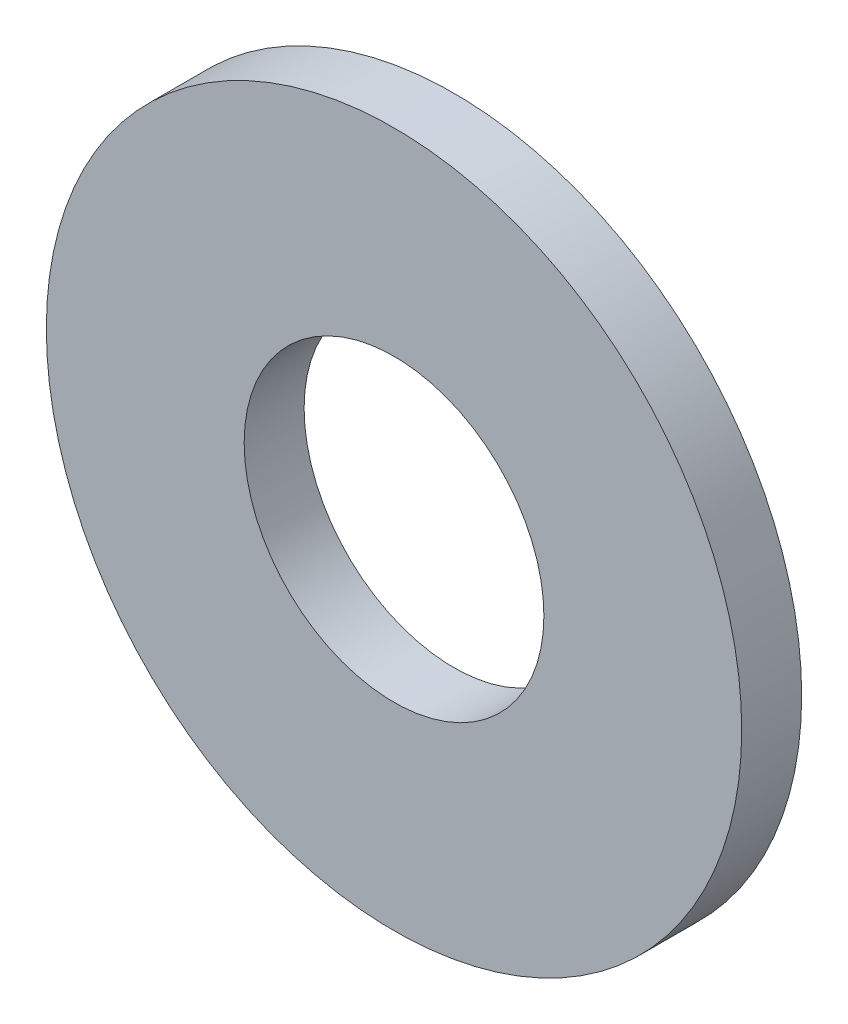
ISO-10303-21;
HEADER;
FILE_DESCRIPTION(('STEP AP214'),'2;1');
FILE_NAME('part.step','',(''),(''),'','','');
FILE_SCHEMA(('AUTOMOTIVE_DESIGN { 1 0 10303 214 1 1 1 1 }'));
ENDSEC;
DATA;
#1=APPLICATION_CONTEXT('core data for automotive mechanical design processes');
#2=APPLICATION_PROTOCOL_DEFINITION('international standard','automotive_design',2000,#1);
#3=PRODUCT_CONTEXT('',#1,'mechanical');
#4=PRODUCT('Part','Part','',(#3));
#5=PRODUCT_RELATED_PRODUCT_CATEGORY('part','',(#4));
#6=PRODUCT_DEFINITION_FORMATION('','',#4);
#7=PRODUCT_DEFINITION_CONTEXT('part definition',#1,'design');
#8=PRODUCT_DEFINITION('design','',#6,#7);
#9=PRODUCT_DEFINITION_SHAPE('','',#8);
#10=(LENGTH_UNIT() NAMED_UNIT(*) SI_UNIT(.MILLI.,.METRE.));
#11=(NAMED_UNIT(*) PLANE_ANGLE_UNIT() SI_UNIT($,.RADIAN.));
#12=(NAMED_UNIT(*) SI_UNIT($,.STERADIAN.) SOLID_ANGLE_UNIT());
#13=UNCERTAINTY_MEASURE_WITH_UNIT(LENGTH_MEASURE(1.E-05),#10,'distance_accuracy_value','');
#14=(GEOMETRIC_REPRESENTATION_CONTEXT(3) GLOBAL_UNCERTAINTY_ASSIGNED_CONTEXT((#13)) GLOBAL_UNIT_ASSIGNED_CONTEXT((#10,
#11,#12)) REPRESENTATION_CONTEXT('',''));
#15=CARTESIAN_POINT('',(0.,0.,0.));
#16=DIRECTION('',(0.,0.,1.));
#17=DIRECTION('',(1.,0.,0.));
#18=AXIS2_PLACEMENT_3D('',#15,#16,#17);
#19=CARTESIAN_POINT('',(0.,0.,1.));
#20=DIRECTION('',(0.,0.,1.));
#21=DIRECTION('',(1.,0.,0.));
#22=AXIS2_PLACEMENT_3D('',#19,#20,#21);
#23=PLANE('',#22);
#24=CARTESIAN_POINT('',(0.,0.,1.));
#25=DIRECTION('',(0.,0.,1.));
#26=DIRECTION('',(1.,0.,0.));
#27=AXIS2_PLACEMENT_3D('',#24,#25,#26);
#28=CIRCLE('',#27,5.8);
#29=CARTESIAN_POINT('',(5.8,0.,1.));
#30=VERTEX_POINT('',#29);
#31=EDGE_CURVE('E10',#30,#30,#28,.T.);
#32=ORIENTED_EDGE('',*,*,#31,.T.);
#33=EDGE_LOOP('',(#32));
#34=FACE_BOUND('',#33,.T.);
#35=CARTESIAN_POINT('',(0.,0.,1.));
#36=DIRECTION('',(0.,0.,1.));
#37=DIRECTION('',(1.,0.,0.));
#38=AXIS2_PLACEMENT_3D('',#35,#36,#37);
#39=CIRCLE('',#38,2.5);
#40=CARTESIAN_POINT('',(2.5,0.,1.));
#41=VERTEX_POINT('',#40);
#42=EDGE_CURVE('E42',#41,#41,#39,.T.);
#43=ORIENTED_EDGE('',*,*,#42,.F.);
#44=EDGE_LOOP('',(#43));
#45=FACE_BOUND('',#44,.T.);
#46=ADVANCED_FACE('F31',(#34,#45),#23,.T.);
#47=CARTESIAN_POINT('',(0.,0.,0.));
#48=DIRECTION('',(0.,0.,1.));
#49=DIRECTION('',(1.,0.,0.));
#50=AXIS2_PLACEMENT_3D('',#47,#48,#49);
#51=PLANE('',#50);
#52=CARTESIAN_POINT('',(0.,0.,0.));
#53=DIRECTION('',(0.,0.,1.));
#54=DIRECTION('',(1.,0.,0.));
#55=AXIS2_PLACEMENT_3D('',#52,#53,#54);
#56=CIRCLE('',#55,5.8);
#57=CARTESIAN_POINT('',(5.8,0.,0.));
#58=VERTEX_POINT('',#57);
#59=EDGE_CURVE('E35',#58,#58,#56,.T.);
#60=ORIENTED_EDGE('',*,*,#59,.F.);
#61=EDGE_LOOP('',(#60));
#62=FACE_BOUND('',#61,.T.);
#63=CARTESIAN_POINT('',(0.,0.,0.));
#64=DIRECTION('',(0.,0.,1.));
#65=DIRECTION('',(1.,0.,0.));
#66=AXIS2_PLACEMENT_3D('',#63,#64,#65);
#67=CIRCLE('',#66,2.5);
#68=CARTESIAN_POINT('',(2.5,0.,0.));
#69=VERTEX_POINT('',#68);
#70=EDGE_CURVE('E44',#69,#69,#67,.T.);
#71=ORIENTED_EDGE('',*,*,#70,.T.);
#72=EDGE_LOOP('',(#71));
#73=FACE_BOUND('',#72,.T.);
#74=ADVANCED_FACE('F54',(#62,#73),#51,.F.);
#75=CARTESIAN_POINT('',(0.,0.,1.));
#76=DIRECTION('',(0.,0.,-1.));
#77=DIRECTION('',(-1.,0.,0.));
#78=AXIS2_PLACEMENT_3D('',#75,#76,#77);
#79=CYLINDRICAL_SURFACE('',#78,5.8);
#80=ORIENTED_EDGE('',*,*,#31,.F.);
#81=EDGE_LOOP('',(#80));
#82=FACE_BOUND('',#81,.T.);
#83=ORIENTED_EDGE('',*,*,#59,.T.);
#84=EDGE_LOOP('',(#83));
#85=FACE_BOUND('',#84,.T.);
#86=ADVANCED_FACE('F33',(#82,#85),#79,.T.);
#87=CARTESIAN_POINT('',(0.,0.,1.));
#88=DIRECTION('',(0.,0.,-1.));
#89=DIRECTION('',(-1.,0.,0.));
#90=AXIS2_PLACEMENT_3D('',#87,#88,#89);
#91=CYLINDRICAL_SURFACE('',#90,2.5);
#92=ORIENTED_EDGE('',*,*,#42,.T.);
#93=EDGE_LOOP('',(#92));
#94=FACE_BOUND('',#93,.T.);
#95=ORIENTED_EDGE('',*,*,#70,.F.);
#96=EDGE_LOOP('',(#95));
#97=FACE_BOUND('',#96,.T.);
#98=ADVANCED_FACE('F50',(#94,#97),#91,.F.);
#99=CLOSED_SHELL('',(#46,#74,#86,#98));
#100=MANIFOLD_SOLID_BREP('B2',#99);
#101=ADVANCED_BREP_SHAPE_REPRESENTATION('',(#18,#100),#14);
#102=SHAPE_DEFINITION_REPRESENTATION(#9,#101);
ENDSEC;
END-ISO-10303-21;
